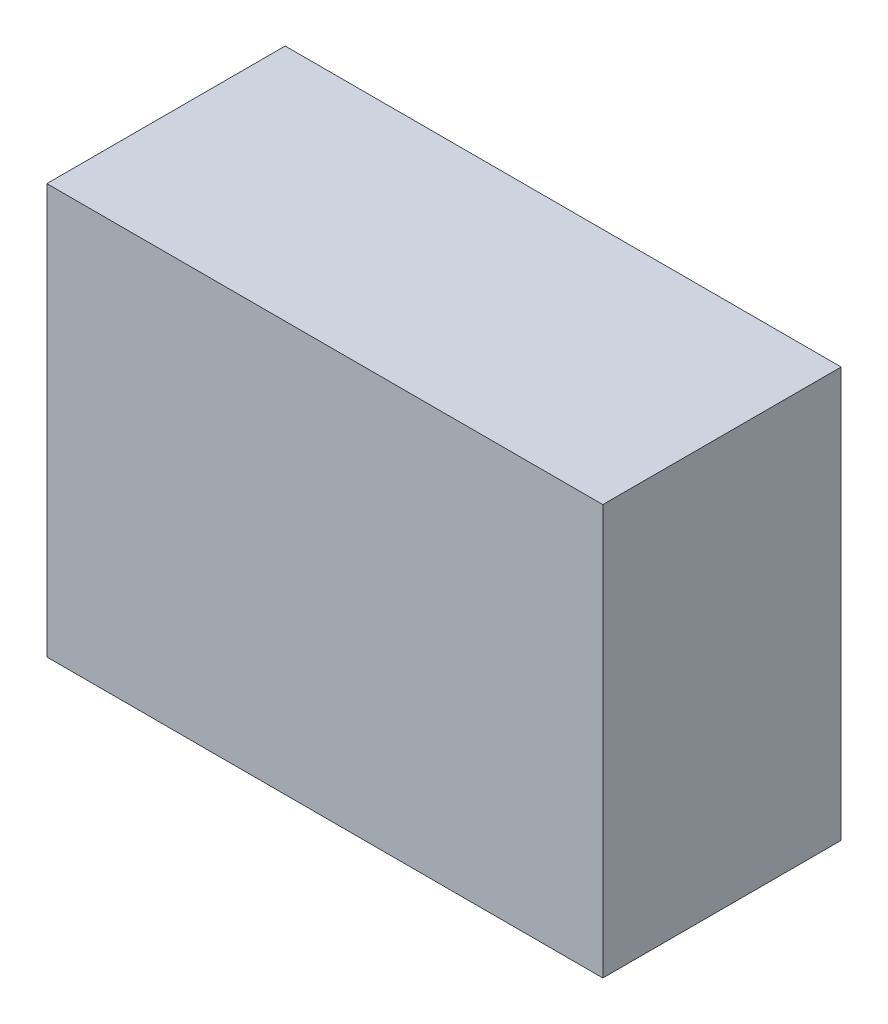
ISO-10303-21;
HEADER;
FILE_DESCRIPTION(('STEP AP214'),'2;1');
FILE_NAME('part.step','',(''),(''),'','','');
FILE_SCHEMA(('AUTOMOTIVE_DESIGN { 1 0 10303 214 1 1 1 1 }'));
ENDSEC;
DATA;
#1=APPLICATION_CONTEXT('core data for automotive mechanical design processes');
#2=APPLICATION_PROTOCOL_DEFINITION('international standard','automotive_design',2000,#1);
#3=PRODUCT_CONTEXT('',#1,'mechanical');
#4=PRODUCT('Part','Part','',(#3));
#5=PRODUCT_RELATED_PRODUCT_CATEGORY('part','',(#4));
#6=PRODUCT_DEFINITION_FORMATION('','',#4);
#7=PRODUCT_DEFINITION_CONTEXT('part definition',#1,'design');
#8=PRODUCT_DEFINITION('design','',#6,#7);
#9=PRODUCT_DEFINITION_SHAPE('','',#8);
#10=(LENGTH_UNIT() NAMED_UNIT(*) SI_UNIT(.MILLI.,.METRE.));
#11=(NAMED_UNIT(*) PLANE_ANGLE_UNIT() SI_UNIT($,.RADIAN.));
#12=(NAMED_UNIT(*) SI_UNIT($,.STERADIAN.) SOLID_ANGLE_UNIT());
#13=UNCERTAINTY_MEASURE_WITH_UNIT(LENGTH_MEASURE(1.E-05),#10,'distance_accuracy_value','');
#14=(GEOMETRIC_REPRESENTATION_CONTEXT(3) GLOBAL_UNCERTAINTY_ASSIGNED_CONTEXT((#13)) GLOBAL_UNIT_ASSIGNED_CONTEXT((#10,
#11,#12)) REPRESENTATION_CONTEXT('',''));
#15=CARTESIAN_POINT('',(0.,0.,0.));
#16=DIRECTION('',(0.,0.,1.));
#17=DIRECTION('',(1.,0.,0.));
#18=AXIS2_PLACEMENT_3D('',#15,#16,#17);
#19=CARTESIAN_POINT('',(-23.6157818820295,-15.6539109704938,1.58));
#20=DIRECTION('',(0.,0.,1.));
#21=DIRECTION('',(1.,0.,0.));
#22=AXIS2_PLACEMENT_3D('',#19,#20,#21);
#23=PLANE('',#22);
#24=DIRECTION('',(0.,1.,0.));
#25=VECTOR('',#24,1.);
#26=CARTESIAN_POINT('',(-25.,-15.6539109704938,1.58));
#27=LINE('',#26,#25);
#28=CARTESIAN_POINT('',(-25.,-14.6331598277293,1.58));
#29=VERTEX_POINT('',#28);
#30=CARTESIAN_POINT('',(-25.,-16.6746621132584,1.58));
#31=VERTEX_POINT('',#30);
#32=EDGE_CURVE('E20',#29,#31,#27,.F.);
#33=ORIENTED_EDGE('',*,*,#32,.F.);
#34=DIRECTION('',(1.,0.,0.));
#35=VECTOR('',#34,1.);
#36=CARTESIAN_POINT('',(-23.6157818820295,-14.6331598277293,1.58));
#37=LINE('',#36,#35);
#38=CARTESIAN_POINT('',(-22.2315637640589,-14.6331598277293,1.58));
#39=VERTEX_POINT('',#38);
#40=EDGE_CURVE('E80',#39,#29,#37,.F.);
#41=ORIENTED_EDGE('',*,*,#40,.F.);
#42=DIRECTION('',(0.,1.,0.));
#43=VECTOR('',#42,1.);
#44=CARTESIAN_POINT('',(-22.2315637640589,-15.6539109704938,1.58));
#45=LINE('',#44,#43);
#46=CARTESIAN_POINT('',(-22.2315637640589,-16.6746621132584,1.58));
#47=VERTEX_POINT('',#46);
#48=EDGE_CURVE('E68',#47,#39,#45,.T.);
#49=ORIENTED_EDGE('',*,*,#48,.F.);
#50=DIRECTION('',(1.,0.,0.));
#51=VECTOR('',#50,1.);
#52=CARTESIAN_POINT('',(-23.6157818820295,-16.6746621132584,1.58));
#53=LINE('',#52,#51);
#54=EDGE_CURVE('E55',#31,#47,#53,.T.);
#55=ORIENTED_EDGE('',*,*,#54,.F.);
#56=EDGE_LOOP('',(#33,#41,#49,#55));
#57=FACE_BOUND('',#56,.T.);
#58=ADVANCED_FACE('F17',(#57),#23,.F.);
#59=CARTESIAN_POINT('',(-25.,-15.6539109704938,1.58));
#60=DIRECTION('',(-1.,0.,0.));
#61=DIRECTION('',(0.,0.,1.));
#62=AXIS2_PLACEMENT_3D('',#59,#60,#61);
#63=PLANE('',#62);
#64=ORIENTED_EDGE('',*,*,#32,.T.);
#65=DIRECTION('',(0.,0.,-1.));
#66=VECTOR('',#65,1.);
#67=CARTESIAN_POINT('',(-25.,-16.6746621132584,1.58));
#68=LINE('',#67,#66);
#69=CARTESIAN_POINT('',(-25.,-16.6746621132584,2.76679060143958));
#70=VERTEX_POINT('',#69);
#71=EDGE_CURVE('E61',#70,#31,#68,.T.);
#72=ORIENTED_EDGE('',*,*,#71,.F.);
#73=DIRECTION('',(0.,1.,0.));
#74=VECTOR('',#73,1.);
#75=CARTESIAN_POINT('',(-25.,-15.6539109704938,2.76679060143958));
#76=LINE('',#75,#74);
#77=CARTESIAN_POINT('',(-25.,-14.6331598277293,2.76679060143958));
#78=VERTEX_POINT('',#77);
#79=EDGE_CURVE('E83',#78,#70,#76,.F.);
#80=ORIENTED_EDGE('',*,*,#79,.F.);
#81=DIRECTION('',(0.,0.,1.));
#82=VECTOR('',#81,1.);
#83=CARTESIAN_POINT('',(-25.,-14.6331598277293,1.58));
#84=LINE('',#83,#82);
#85=EDGE_CURVE('E64',#29,#78,#84,.T.);
#86=ORIENTED_EDGE('',*,*,#85,.F.);
#87=EDGE_LOOP('',(#64,#72,#80,#86));
#88=FACE_BOUND('',#87,.T.);
#89=ADVANCED_FACE('F60',(#88),#63,.T.);
#90=CARTESIAN_POINT('',(-23.6157818820295,-16.6746621132584,1.58));
#91=DIRECTION('',(0.,-1.,0.));
#92=DIRECTION('',(0.,0.,-1.));
#93=AXIS2_PLACEMENT_3D('',#90,#91,#92);
#94=PLANE('',#93);
#95=ORIENTED_EDGE('',*,*,#54,.T.);
#96=DIRECTION('',(0.,0.,-1.));
#97=VECTOR('',#96,1.);
#98=CARTESIAN_POINT('',(-22.2315637640589,-16.6746621132584,1.58));
#99=LINE('',#98,#97);
#100=CARTESIAN_POINT('',(-22.2315637640589,-16.6746621132584,2.76679060143958));
#101=VERTEX_POINT('',#100);
#102=EDGE_CURVE('E70',#101,#47,#99,.T.);
#103=ORIENTED_EDGE('',*,*,#102,.F.);
#104=DIRECTION('',(1.,0.,0.));
#105=VECTOR('',#104,1.);
#106=CARTESIAN_POINT('',(-23.6157818820295,-16.6746621132584,2.76679060143958));
#107=LINE('',#106,#105);
#108=EDGE_CURVE('E74',#70,#101,#107,.T.);
#109=ORIENTED_EDGE('',*,*,#108,.F.);
#110=ORIENTED_EDGE('',*,*,#71,.T.);
#111=EDGE_LOOP('',(#95,#103,#109,#110));
#112=FACE_BOUND('',#111,.T.);
#113=ADVANCED_FACE('F72',(#112),#94,.T.);
#114=CARTESIAN_POINT('',(-22.2315637640589,-15.6539109704938,1.58));
#115=DIRECTION('',(1.,0.,0.));
#116=DIRECTION('',(0.,0.,-1.));
#117=AXIS2_PLACEMENT_3D('',#114,#115,#116);
#118=PLANE('',#117);
#119=ORIENTED_EDGE('',*,*,#48,.T.);
#120=DIRECTION('',(0.,0.,1.));
#121=VECTOR('',#120,1.);
#122=CARTESIAN_POINT('',(-22.2315637640589,-14.6331598277293,1.58));
#123=LINE('',#122,#121);
#124=CARTESIAN_POINT('',(-22.2315637640589,-14.6331598277293,2.76679060143958));
#125=VERTEX_POINT('',#124);
#126=EDGE_CURVE('E35',#125,#39,#123,.F.);
#127=ORIENTED_EDGE('',*,*,#126,.F.);
#128=DIRECTION('',(0.,1.,0.));
#129=VECTOR('',#128,1.);
#130=CARTESIAN_POINT('',(-22.2315637640589,-15.6539109704938,2.76679060143958));
#131=LINE('',#130,#129);
#132=EDGE_CURVE('E26',#101,#125,#131,.T.);
#133=ORIENTED_EDGE('',*,*,#132,.F.);
#134=ORIENTED_EDGE('',*,*,#102,.T.);
#135=EDGE_LOOP('',(#119,#127,#133,#134));
#136=FACE_BOUND('',#135,.T.);
#137=ADVANCED_FACE('F89',(#136),#118,.T.);
#138=CARTESIAN_POINT('',(-23.6157818820295,-14.6331598277293,1.58));
#139=DIRECTION('',(0.,1.,0.));
#140=DIRECTION('',(0.,0.,1.));
#141=AXIS2_PLACEMENT_3D('',#138,#139,#140);
#142=PLANE('',#141);
#143=ORIENTED_EDGE('',*,*,#40,.T.);
#144=ORIENTED_EDGE('',*,*,#85,.T.);
#145=DIRECTION('',(1.,0.,0.));
#146=VECTOR('',#145,1.);
#147=CARTESIAN_POINT('',(-23.6157818820295,-14.6331598277293,2.76679060143958));
#148=LINE('',#147,#146);
#149=EDGE_CURVE('E11',#125,#78,#148,.F.);
#150=ORIENTED_EDGE('',*,*,#149,.F.);
#151=ORIENTED_EDGE('',*,*,#126,.T.);
#152=EDGE_LOOP('',(#143,#144,#150,#151));
#153=FACE_BOUND('',#152,.T.);
#154=ADVANCED_FACE('F91',(#153),#142,.T.);
#155=CARTESIAN_POINT('',(-23.6157818820295,-15.6539109704938,2.76679060143958));
#156=DIRECTION('',(0.,0.,1.));
#157=DIRECTION('',(1.,0.,0.));
#158=AXIS2_PLACEMENT_3D('',#155,#156,#157);
#159=PLANE('',#158);
#160=ORIENTED_EDGE('',*,*,#132,.T.);
#161=ORIENTED_EDGE('',*,*,#149,.T.);
#162=ORIENTED_EDGE('',*,*,#79,.T.);
#163=ORIENTED_EDGE('',*,*,#108,.T.);
#164=EDGE_LOOP('',(#160,#161,#162,#163));
#165=FACE_BOUND('',#164,.T.);
#166=ADVANCED_FACE('F88',(#165),#159,.T.);
#167=CLOSED_SHELL('',(#58,#89,#113,#137,#154,#166));
#168=MANIFOLD_SOLID_BREP('B1',#167);
#169=ADVANCED_BREP_SHAPE_REPRESENTATION('',(#18,#168),#14);
#170=SHAPE_DEFINITION_REPRESENTATION(#9,#169);
ENDSEC;
END-ISO-10303-21;
